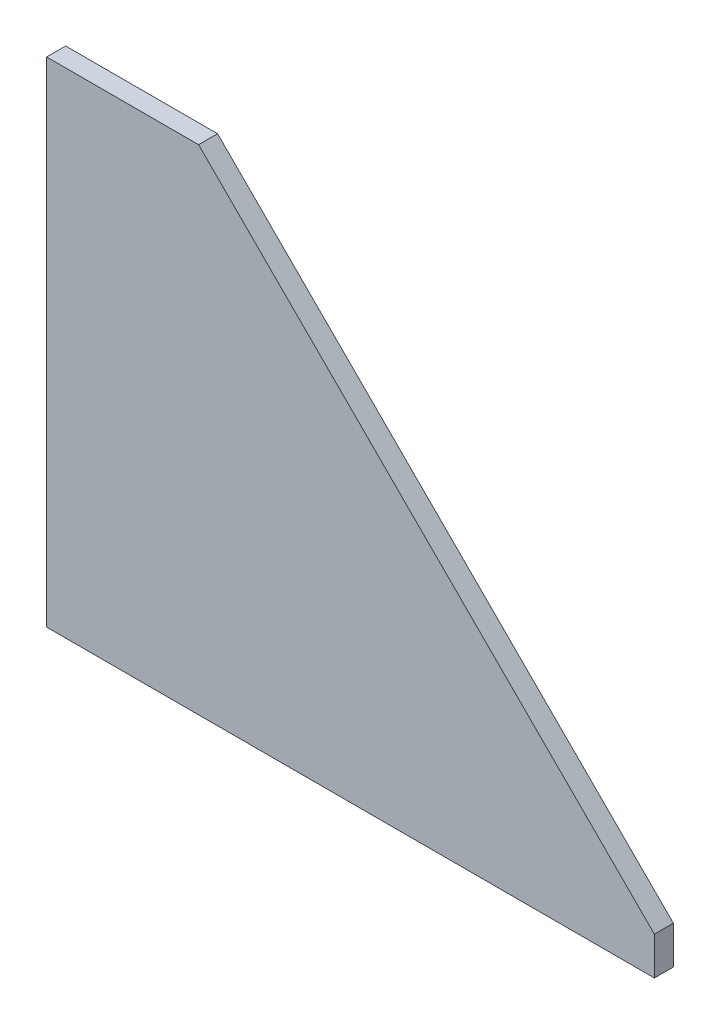
ISO-10303-21;
HEADER;
FILE_DESCRIPTION(('STEP AP214'),'2;1');
FILE_NAME('part.step','',(''),(''),'','','');
FILE_SCHEMA(('AUTOMOTIVE_DESIGN { 1 0 10303 214 1 1 1 1 }'));
ENDSEC;
DATA;
#1=APPLICATION_CONTEXT('core data for automotive mechanical design processes');
#2=APPLICATION_PROTOCOL_DEFINITION('international standard','automotive_design',2000,#1);
#3=PRODUCT_CONTEXT('',#1,'mechanical');
#4=PRODUCT('Part','Part','',(#3));
#5=PRODUCT_RELATED_PRODUCT_CATEGORY('part','',(#4));
#6=PRODUCT_DEFINITION_FORMATION('','',#4);
#7=PRODUCT_DEFINITION_CONTEXT('part definition',#1,'design');
#8=PRODUCT_DEFINITION('design','',#6,#7);
#9=PRODUCT_DEFINITION_SHAPE('','',#8);
#10=(LENGTH_UNIT() NAMED_UNIT(*) SI_UNIT(.MILLI.,.METRE.));
#11=(NAMED_UNIT(*) PLANE_ANGLE_UNIT() SI_UNIT($,.RADIAN.));
#12=(NAMED_UNIT(*) SI_UNIT($,.STERADIAN.) SOLID_ANGLE_UNIT());
#13=UNCERTAINTY_MEASURE_WITH_UNIT(LENGTH_MEASURE(1.E-05),#10,'distance_accuracy_value','');
#14=(GEOMETRIC_REPRESENTATION_CONTEXT(3) GLOBAL_UNCERTAINTY_ASSIGNED_CONTEXT((#13)) GLOBAL_UNIT_ASSIGNED_CONTEXT((#10,
#11,#12)) REPRESENTATION_CONTEXT('',''));
#15=CARTESIAN_POINT('',(0.,0.,0.));
#16=DIRECTION('',(0.,0.,1.));
#17=DIRECTION('',(1.,0.,0.));
#18=AXIS2_PLACEMENT_3D('',#15,#16,#17);
#19=CARTESIAN_POINT('',(0.,0.,0.));
#20=DIRECTION('',(0.,0.,-1.));
#21=DIRECTION('',(-1.,0.,0.));
#22=AXIS2_PLACEMENT_3D('',#19,#20,#21);
#23=PLANE('',#22);
#24=DIRECTION('',(0.,1.,0.));
#25=VECTOR('',#24,1.);
#26=CARTESIAN_POINT('',(101.6,6.35,0.));
#27=LINE('',#26,#25);
#28=CARTESIAN_POINT('',(101.6,6.35000000000001,0.));
#29=VERTEX_POINT('',#28);
#30=CARTESIAN_POINT('',(101.6,0.,0.));
#31=VERTEX_POINT('',#30);
#32=EDGE_CURVE('E82',#29,#31,#27,.F.);
#33=ORIENTED_EDGE('',*,*,#32,.T.);
#34=DIRECTION('',(1.,0.,0.));
#35=VECTOR('',#34,1.);
#36=CARTESIAN_POINT('',(0.,0.,0.));
#37=LINE('',#36,#35);
#38=CARTESIAN_POINT('',(0.,0.,0.));
#39=VERTEX_POINT('',#38);
#40=EDGE_CURVE('E87',#31,#39,#37,.F.);
#41=ORIENTED_EDGE('',*,*,#40,.T.);
#42=DIRECTION('',(0.,1.,0.));
#43=VECTOR('',#42,1.);
#44=CARTESIAN_POINT('',(0.,0.,0.));
#45=LINE('',#44,#43);
#46=CARTESIAN_POINT('',(0.,82.55,0.));
#47=VERTEX_POINT('',#46);
#48=EDGE_CURVE('E64',#39,#47,#45,.T.);
#49=ORIENTED_EDGE('',*,*,#48,.T.);
#50=DIRECTION('',(1.,0.,0.));
#51=VECTOR('',#50,1.);
#52=CARTESIAN_POINT('',(0.,82.55,0.));
#53=LINE('',#52,#51);
#54=CARTESIAN_POINT('',(25.4,82.55,0.));
#55=VERTEX_POINT('',#54);
#56=EDGE_CURVE('E20',#47,#55,#53,.T.);
#57=ORIENTED_EDGE('',*,*,#56,.T.);
#58=DIRECTION('',(0.707106781186547,-0.707106781186548,0.));
#59=VECTOR('',#58,1.);
#60=CARTESIAN_POINT('',(25.4,82.55,0.));
#61=LINE('',#60,#59);
#62=EDGE_CURVE('E61',#55,#29,#61,.T.);
#63=ORIENTED_EDGE('',*,*,#62,.T.);
#64=EDGE_LOOP('',(#33,#41,#49,#57,#63));
#65=FACE_BOUND('',#64,.T.);
#66=ADVANCED_FACE('F17',(#65),#23,.T.);
#67=CARTESIAN_POINT('',(0.,82.55,3.175));
#68=DIRECTION('',(0.,-1.,0.));
#69=DIRECTION('',(0.,0.,-1.));
#70=AXIS2_PLACEMENT_3D('',#67,#68,#69);
#71=PLANE('',#70);
#72=DIRECTION('',(0.,0.,-1.));
#73=VECTOR('',#72,1.);
#74=CARTESIAN_POINT('',(0.,82.55,3.175));
#75=LINE('',#74,#73);
#76=CARTESIAN_POINT('',(0.,82.55,3.175));
#77=VERTEX_POINT('',#76);
#78=EDGE_CURVE('E89',#47,#77,#75,.F.);
#79=ORIENTED_EDGE('',*,*,#78,.T.);
#80=DIRECTION('',(-1.,0.,0.));
#81=VECTOR('',#80,1.);
#82=CARTESIAN_POINT('',(0.,82.55,3.175));
#83=LINE('',#82,#81);
#84=CARTESIAN_POINT('',(25.4,82.55,3.175));
#85=VERTEX_POINT('',#84);
#86=EDGE_CURVE('E79',#77,#85,#83,.F.);
#87=ORIENTED_EDGE('',*,*,#86,.T.);
#88=DIRECTION('',(0.,0.,1.));
#89=VECTOR('',#88,1.);
#90=CARTESIAN_POINT('',(25.4,82.55,3.175));
#91=LINE('',#90,#89);
#92=EDGE_CURVE('E69',#85,#55,#91,.F.);
#93=ORIENTED_EDGE('',*,*,#92,.T.);
#94=ORIENTED_EDGE('',*,*,#56,.F.);
#95=EDGE_LOOP('',(#79,#87,#93,#94));
#96=FACE_BOUND('',#95,.T.);
#97=ADVANCED_FACE('F78',(#96),#71,.F.);
#98=CARTESIAN_POINT('',(25.4,82.55,3.175));
#99=DIRECTION('',(-0.707106781186548,-0.707106781186547,0.));
#100=DIRECTION('',(0.707106781186547,-0.707106781186548,0.));
#101=AXIS2_PLACEMENT_3D('',#98,#99,#100);
#102=PLANE('',#101);
#103=ORIENTED_EDGE('',*,*,#92,.F.);
#104=DIRECTION('',(0.707106781186547,-0.707106781186547,0.));
#105=VECTOR('',#104,1.);
#106=CARTESIAN_POINT('',(25.4,82.55,3.175));
#107=LINE('',#106,#105);
#108=CARTESIAN_POINT('',(101.6,6.35000000000001,3.175));
#109=VERTEX_POINT('',#108);
#110=EDGE_CURVE('E94',#85,#109,#107,.T.);
#111=ORIENTED_EDGE('',*,*,#110,.T.);
#112=DIRECTION('',(0.,0.,1.));
#113=VECTOR('',#112,1.);
#114=CARTESIAN_POINT('',(101.6,6.35,3.175));
#115=LINE('',#114,#113);
#116=EDGE_CURVE('E75',#109,#29,#115,.F.);
#117=ORIENTED_EDGE('',*,*,#116,.T.);
#118=ORIENTED_EDGE('',*,*,#62,.F.);
#119=EDGE_LOOP('',(#103,#111,#117,#118));
#120=FACE_BOUND('',#119,.T.);
#121=ADVANCED_FACE('F72',(#120),#102,.F.);
#122=CARTESIAN_POINT('',(101.6,6.35,3.175));
#123=DIRECTION('',(-1.,0.,0.));
#124=DIRECTION('',(0.,0.,1.));
#125=AXIS2_PLACEMENT_3D('',#122,#123,#124);
#126=PLANE('',#125);
#127=ORIENTED_EDGE('',*,*,#116,.F.);
#128=DIRECTION('',(0.,1.,0.));
#129=VECTOR('',#128,1.);
#130=CARTESIAN_POINT('',(101.6,0.,3.175));
#131=LINE('',#130,#129);
#132=CARTESIAN_POINT('',(101.6,0.,3.175));
#133=VERTEX_POINT('',#132);
#134=EDGE_CURVE('E96',#109,#133,#131,.F.);
#135=ORIENTED_EDGE('',*,*,#134,.T.);
#136=DIRECTION('',(0.,0.,1.));
#137=VECTOR('',#136,1.);
#138=CARTESIAN_POINT('',(101.6,0.,3.175));
#139=LINE('',#138,#137);
#140=EDGE_CURVE('E84',#133,#31,#139,.F.);
#141=ORIENTED_EDGE('',*,*,#140,.T.);
#142=ORIENTED_EDGE('',*,*,#32,.F.);
#143=EDGE_LOOP('',(#127,#135,#141,#142));
#144=FACE_BOUND('',#143,.T.);
#145=ADVANCED_FACE('F108',(#144),#126,.F.);
#146=CARTESIAN_POINT('',(0.,0.,3.175));
#147=DIRECTION('',(0.,1.,0.));
#148=DIRECTION('',(0.,0.,1.));
#149=AXIS2_PLACEMENT_3D('',#146,#147,#148);
#150=PLANE('',#149);
#151=ORIENTED_EDGE('',*,*,#140,.F.);
#152=DIRECTION('',(-1.,0.,0.));
#153=VECTOR('',#152,1.);
#154=CARTESIAN_POINT('',(0.,0.,3.175));
#155=LINE('',#154,#153);
#156=CARTESIAN_POINT('',(0.,0.,3.175));
#157=VERTEX_POINT('',#156);
#158=EDGE_CURVE('E26',#133,#157,#155,.T.);
#159=ORIENTED_EDGE('',*,*,#158,.T.);
#160=DIRECTION('',(0.,0.,-1.));
#161=VECTOR('',#160,1.);
#162=CARTESIAN_POINT('',(0.,0.,3.175));
#163=LINE('',#162,#161);
#164=EDGE_CURVE('E34',#157,#39,#163,.T.);
#165=ORIENTED_EDGE('',*,*,#164,.T.);
#166=ORIENTED_EDGE('',*,*,#40,.F.);
#167=EDGE_LOOP('',(#151,#159,#165,#166));
#168=FACE_BOUND('',#167,.T.);
#169=ADVANCED_FACE('F102',(#168),#150,.F.);
#170=CARTESIAN_POINT('',(0.,0.,3.175));
#171=DIRECTION('',(1.,0.,0.));
#172=DIRECTION('',(0.,0.,-1.));
#173=AXIS2_PLACEMENT_3D('',#170,#171,#172);
#174=PLANE('',#173);
#175=ORIENTED_EDGE('',*,*,#164,.F.);
#176=DIRECTION('',(0.,1.,0.));
#177=VECTOR('',#176,1.);
#178=CARTESIAN_POINT('',(0.,0.,3.175));
#179=LINE('',#178,#177);
#180=EDGE_CURVE('E11',#157,#77,#179,.T.);
#181=ORIENTED_EDGE('',*,*,#180,.T.);
#182=ORIENTED_EDGE('',*,*,#78,.F.);
#183=ORIENTED_EDGE('',*,*,#48,.F.);
#184=EDGE_LOOP('',(#175,#181,#182,#183));
#185=FACE_BOUND('',#184,.T.);
#186=ADVANCED_FACE('F109',(#185),#174,.F.);
#187=CARTESIAN_POINT('',(0.,0.,3.175));
#188=DIRECTION('',(0.,0.,-1.));
#189=DIRECTION('',(-1.,0.,0.));
#190=AXIS2_PLACEMENT_3D('',#187,#188,#189);
#191=PLANE('',#190);
#192=ORIENTED_EDGE('',*,*,#158,.F.);
#193=ORIENTED_EDGE('',*,*,#134,.F.);
#194=ORIENTED_EDGE('',*,*,#110,.F.);
#195=ORIENTED_EDGE('',*,*,#86,.F.);
#196=ORIENTED_EDGE('',*,*,#180,.F.);
#197=EDGE_LOOP('',(#192,#193,#194,#195,#196));
#198=FACE_BOUND('',#197,.T.);
#199=ADVANCED_FACE('F106',(#198),#191,.F.);
#200=CLOSED_SHELL('',(#66,#97,#121,#145,#169,#186,#199));
#201=MANIFOLD_SOLID_BREP('B1',#200);
#202=ADVANCED_BREP_SHAPE_REPRESENTATION('',(#18,#201),#14);
#203=SHAPE_DEFINITION_REPRESENTATION(#9,#202);
ENDSEC;
END-ISO-10303-21;
